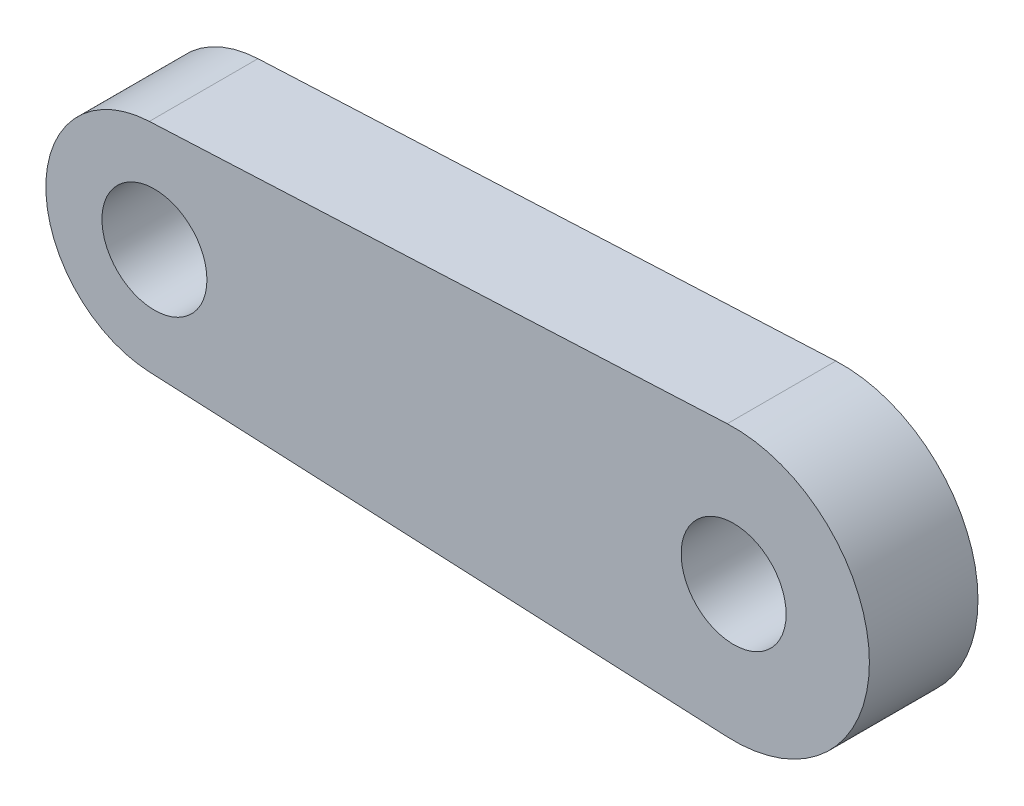
ISO-10303-21;
HEADER;
FILE_DESCRIPTION(('STEP AP214'),'2;1');
FILE_NAME('part.step','',(''),(''),'','','');
FILE_SCHEMA(('AUTOMOTIVE_DESIGN { 1 0 10303 214 1 1 1 1 }'));
ENDSEC;
DATA;
#1=APPLICATION_CONTEXT('core data for automotive mechanical design processes');
#2=APPLICATION_PROTOCOL_DEFINITION('international standard','automotive_design',2000,#1);
#3=PRODUCT_CONTEXT('',#1,'mechanical');
#4=PRODUCT('Part','Part','',(#3));
#5=PRODUCT_RELATED_PRODUCT_CATEGORY('part','',(#4));
#6=PRODUCT_DEFINITION_FORMATION('','',#4);
#7=PRODUCT_DEFINITION_CONTEXT('part definition',#1,'design');
#8=PRODUCT_DEFINITION('design','',#6,#7);
#9=PRODUCT_DEFINITION_SHAPE('','',#8);
#10=(LENGTH_UNIT() NAMED_UNIT(*) SI_UNIT(.MILLI.,.METRE.));
#11=(NAMED_UNIT(*) PLANE_ANGLE_UNIT() SI_UNIT($,.RADIAN.));
#12=(NAMED_UNIT(*) SI_UNIT($,.STERADIAN.) SOLID_ANGLE_UNIT());
#13=UNCERTAINTY_MEASURE_WITH_UNIT(LENGTH_MEASURE(1.E-05),#10,'distance_accuracy_value','');
#14=(GEOMETRIC_REPRESENTATION_CONTEXT(3) GLOBAL_UNCERTAINTY_ASSIGNED_CONTEXT((#13)) GLOBAL_UNIT_ASSIGNED_CONTEXT((#10,
#11,#12)) REPRESENTATION_CONTEXT('',''));
#15=CARTESIAN_POINT('',(0.,0.,0.));
#16=DIRECTION('',(0.,0.,1.));
#17=DIRECTION('',(1.,0.,0.));
#18=AXIS2_PLACEMENT_3D('',#15,#16,#17);
#19=CARTESIAN_POINT('',(7.6248333333333,1.11022302462516E-13,3.));
#20=DIRECTION('',(0.,0.,1.));
#21=DIRECTION('',(1.,0.,0.));
#22=AXIS2_PLACEMENT_3D('',#19,#20,#21);
#23=PLANE('',#22);
#24=CARTESIAN_POINT('',(7.6248333333333,1.11022302462516E-13,3.));
#25=DIRECTION('',(0.,0.,1.));
#26=DIRECTION('',(1.,0.,0.));
#27=AXIS2_PLACEMENT_3D('',#24,#25,#26);
#28=CIRCLE('',#27,1.44999999999995);
#29=CARTESIAN_POINT('',(9.07483333333325,1.11022302462516E-13,3.));
#30=VERTEX_POINT('',#29);
#31=EDGE_CURVE('E99',#30,#30,#28,.T.);
#32=ORIENTED_EDGE('',*,*,#31,.F.);
#33=EDGE_LOOP('',(#32));
#34=FACE_BOUND('',#33,.T.);
#35=CARTESIAN_POINT('',(7.6248333333333,1.11022302462516E-13,3.));
#36=DIRECTION('',(0.,0.,1.));
#37=DIRECTION('',(1.,0.,0.));
#38=AXIS2_PLACEMENT_3D('',#35,#36,#37);
#39=CIRCLE('',#38,3.75);
#40=CARTESIAN_POINT('',(7.44905208333332,-3.74587786134952,3.));
#41=VERTEX_POINT('',#40);
#42=CARTESIAN_POINT('',(7.44905208333332,3.74587786134952,3.));
#43=VERTEX_POINT('',#42);
#44=EDGE_CURVE('E84',#41,#43,#39,.T.);
#45=ORIENTED_EDGE('',*,*,#44,.T.);
#46=DIRECTION('',(-0.998900763026539,-0.046874999999993,0.));
#47=VECTOR('',#46,1.);
#48=CARTESIAN_POINT('',(7.44905208333332,3.74587786134952,3.));
#49=LINE('',#48,#47);
#50=CARTESIAN_POINT('',(-8.5157916666667,2.99670228907984,3.));
#51=VERTEX_POINT('',#50);
#52=EDGE_CURVE('E79',#43,#51,#49,.T.);
#53=ORIENTED_EDGE('',*,*,#52,.T.);
#54=CARTESIAN_POINT('',(-8.37516666666671,1.11022302462516E-13,3.));
#55=DIRECTION('',(0.,0.,1.));
#56=DIRECTION('',(1.,0.,0.));
#57=AXIS2_PLACEMENT_3D('',#54,#55,#56);
#58=CIRCLE('',#57,3.00000000000011);
#59=CARTESIAN_POINT('',(-8.5157916666667,-2.99670228907973,3.));
#60=VERTEX_POINT('',#59);
#61=EDGE_CURVE('E82',#51,#60,#58,.T.);
#62=ORIENTED_EDGE('',*,*,#61,.T.);
#63=DIRECTION('',(0.998900763026539,-0.046874999999993,0.));
#64=VECTOR('',#63,1.);
#65=CARTESIAN_POINT('',(-8.5157916666667,-2.99670228907973,3.));
#66=LINE('',#65,#64);
#67=EDGE_CURVE('E49',#60,#41,#66,.T.);
#68=ORIENTED_EDGE('',*,*,#67,.T.);
#69=EDGE_LOOP('',(#45,#53,#62,#68));
#70=FACE_BOUND('',#69,.T.);
#71=CARTESIAN_POINT('',(-8.37516666666671,1.11022302462516E-13,3.));
#72=DIRECTION('',(0.,0.,1.));
#73=DIRECTION('',(1.,0.,0.));
#74=AXIS2_PLACEMENT_3D('',#71,#72,#73);
#75=CIRCLE('',#74,1.44999999999995);
#76=CARTESIAN_POINT('',(-6.92516666666676,1.11022302462516E-13,3.));
#77=VERTEX_POINT('',#76);
#78=EDGE_CURVE('E114',#77,#77,#75,.T.);
#79=ORIENTED_EDGE('',*,*,#78,.F.);
#80=EDGE_LOOP('',(#79));
#81=FACE_BOUND('',#80,.T.);
#82=ADVANCED_FACE('F32',(#34,#70,#81),#23,.T.);
#83=CARTESIAN_POINT('',(7.6248333333333,1.11022302462516E-13,0.));
#84=DIRECTION('',(0.,0.,1.));
#85=DIRECTION('',(1.,0.,0.));
#86=AXIS2_PLACEMENT_3D('',#83,#84,#85);
#87=PLANE('',#86);
#88=CARTESIAN_POINT('',(7.6248333333333,1.11022302462516E-13,0.));
#89=DIRECTION('',(0.,0.,1.));
#90=DIRECTION('',(1.,0.,0.));
#91=AXIS2_PLACEMENT_3D('',#88,#89,#90);
#92=CIRCLE('',#91,3.75);
#93=CARTESIAN_POINT('',(7.44905208333332,-3.74587786134952,0.));
#94=VERTEX_POINT('',#93);
#95=CARTESIAN_POINT('',(7.44905208333332,3.74587786134952,0.));
#96=VERTEX_POINT('',#95);
#97=EDGE_CURVE('E96',#94,#96,#92,.T.);
#98=ORIENTED_EDGE('',*,*,#97,.F.);
#99=DIRECTION('',(0.998900763026539,-0.046874999999993,0.));
#100=VECTOR('',#99,1.);
#101=CARTESIAN_POINT('',(-8.5157916666667,-2.99670228907973,0.));
#102=LINE('',#101,#100);
#103=CARTESIAN_POINT('',(-8.5157916666667,-2.99670228907973,0.));
#104=VERTEX_POINT('',#103);
#105=EDGE_CURVE('E72',#104,#94,#102,.T.);
#106=ORIENTED_EDGE('',*,*,#105,.F.);
#107=CARTESIAN_POINT('',(-8.37516666666671,1.11022302462516E-13,0.));
#108=DIRECTION('',(0.,0.,1.));
#109=DIRECTION('',(1.,0.,0.));
#110=AXIS2_PLACEMENT_3D('',#107,#108,#109);
#111=CIRCLE('',#110,3.00000000000011);
#112=CARTESIAN_POINT('',(-8.5157916666667,2.99670228907984,0.));
#113=VERTEX_POINT('',#112);
#114=EDGE_CURVE('E66',#113,#104,#111,.T.);
#115=ORIENTED_EDGE('',*,*,#114,.F.);
#116=DIRECTION('',(-0.998900763026539,-0.046874999999993,0.));
#117=VECTOR('',#116,1.);
#118=CARTESIAN_POINT('',(7.44905208333332,3.74587786134952,0.));
#119=LINE('',#118,#117);
#120=EDGE_CURVE('E88',#96,#113,#119,.T.);
#121=ORIENTED_EDGE('',*,*,#120,.F.);
#122=EDGE_LOOP('',(#98,#106,#115,#121));
#123=FACE_BOUND('',#122,.T.);
#124=CARTESIAN_POINT('',(7.6248333333333,1.11022302462516E-13,0.));
#125=DIRECTION('',(0.,0.,1.));
#126=DIRECTION('',(1.,0.,0.));
#127=AXIS2_PLACEMENT_3D('',#124,#125,#126);
#128=CIRCLE('',#127,1.44999999999995);
#129=CARTESIAN_POINT('',(9.07483333333325,1.11022302462516E-13,0.));
#130=VERTEX_POINT('',#129);
#131=EDGE_CURVE('E111',#130,#130,#128,.T.);
#132=ORIENTED_EDGE('',*,*,#131,.T.);
#133=EDGE_LOOP('',(#132));
#134=FACE_BOUND('',#133,.T.);
#135=CARTESIAN_POINT('',(-8.37516666666671,1.11022302462516E-13,0.));
#136=DIRECTION('',(0.,0.,1.));
#137=DIRECTION('',(1.,0.,0.));
#138=AXIS2_PLACEMENT_3D('',#135,#136,#137);
#139=CIRCLE('',#138,1.44999999999995);
#140=CARTESIAN_POINT('',(-6.92516666666676,1.11022302462516E-13,0.));
#141=VERTEX_POINT('',#140);
#142=EDGE_CURVE('E117',#141,#141,#139,.T.);
#143=ORIENTED_EDGE('',*,*,#142,.T.);
#144=EDGE_LOOP('',(#143));
#145=FACE_BOUND('',#144,.T.);
#146=ADVANCED_FACE('F107',(#123,#134,#145),#87,.F.);
#147=CARTESIAN_POINT('',(7.6248333333333,1.11022302462516E-13,3.));
#148=DIRECTION('',(0.,0.,-1.));
#149=DIRECTION('',(-1.,0.,0.));
#150=AXIS2_PLACEMENT_3D('',#147,#148,#149);
#151=CYLINDRICAL_SURFACE('',#150,3.75);
#152=ORIENTED_EDGE('',*,*,#97,.T.);
#153=DIRECTION('',(0.,0.,-1.));
#154=VECTOR('',#153,1.);
#155=CARTESIAN_POINT('',(7.44905208333332,3.74587786134952,3.));
#156=LINE('',#155,#154);
#157=EDGE_CURVE('E11',#43,#96,#156,.T.);
#158=ORIENTED_EDGE('',*,*,#157,.F.);
#159=ORIENTED_EDGE('',*,*,#44,.F.);
#160=DIRECTION('',(0.,0.,-1.));
#161=VECTOR('',#160,1.);
#162=CARTESIAN_POINT('',(7.44905208333332,-3.74587786134952,3.));
#163=LINE('',#162,#161);
#164=EDGE_CURVE('E92',#41,#94,#163,.T.);
#165=ORIENTED_EDGE('',*,*,#164,.T.);
#166=EDGE_LOOP('',(#152,#158,#159,#165));
#167=FACE_BOUND('',#166,.T.);
#168=ADVANCED_FACE('F34',(#167),#151,.T.);
#169=CARTESIAN_POINT('',(7.44905208333332,3.74587786134952,3.));
#170=DIRECTION('',(0.046874999999993,-0.998900763026538,0.));
#171=DIRECTION('',(0.998900763026539,0.046874999999993,0.));
#172=AXIS2_PLACEMENT_3D('',#169,#170,#171);
#173=PLANE('',#172);
#174=ORIENTED_EDGE('',*,*,#120,.T.);
#175=DIRECTION('',(0.,0.,-1.));
#176=VECTOR('',#175,1.);
#177=CARTESIAN_POINT('',(-8.5157916666667,2.99670228907984,3.));
#178=LINE('',#177,#176);
#179=EDGE_CURVE('E41',#51,#113,#178,.T.);
#180=ORIENTED_EDGE('',*,*,#179,.F.);
#181=ORIENTED_EDGE('',*,*,#52,.F.);
#182=ORIENTED_EDGE('',*,*,#157,.T.);
#183=EDGE_LOOP('',(#174,#180,#181,#182));
#184=FACE_BOUND('',#183,.T.);
#185=ADVANCED_FACE('F87',(#184),#173,.F.);
#186=CARTESIAN_POINT('',(-8.37516666666671,1.11022302462516E-13,3.));
#187=DIRECTION('',(0.,0.,-1.));
#188=DIRECTION('',(-1.,0.,0.));
#189=AXIS2_PLACEMENT_3D('',#186,#187,#188);
#190=CYLINDRICAL_SURFACE('',#189,3.00000000000011);
#191=ORIENTED_EDGE('',*,*,#114,.T.);
#192=DIRECTION('',(0.,0.,-1.));
#193=VECTOR('',#192,1.);
#194=CARTESIAN_POINT('',(-8.5157916666667,-2.99670228907973,3.));
#195=LINE('',#194,#193);
#196=EDGE_CURVE('E89',#60,#104,#195,.T.);
#197=ORIENTED_EDGE('',*,*,#196,.F.);
#198=ORIENTED_EDGE('',*,*,#61,.F.);
#199=ORIENTED_EDGE('',*,*,#179,.T.);
#200=EDGE_LOOP('',(#191,#197,#198,#199));
#201=FACE_BOUND('',#200,.T.);
#202=ADVANCED_FACE('F90',(#201),#190,.T.);
#203=CARTESIAN_POINT('',(-8.5157916666667,-2.99670228907973,3.));
#204=DIRECTION('',(0.046874999999993,0.998900763026538,0.));
#205=DIRECTION('',(-0.998900763026539,0.046874999999993,0.));
#206=AXIS2_PLACEMENT_3D('',#203,#204,#205);
#207=PLANE('',#206);
#208=ORIENTED_EDGE('',*,*,#105,.T.);
#209=ORIENTED_EDGE('',*,*,#164,.F.);
#210=ORIENTED_EDGE('',*,*,#67,.F.);
#211=ORIENTED_EDGE('',*,*,#196,.T.);
#212=EDGE_LOOP('',(#208,#209,#210,#211));
#213=FACE_BOUND('',#212,.T.);
#214=ADVANCED_FACE('F104',(#213),#207,.F.);
#215=CARTESIAN_POINT('',(7.6248333333333,1.11022302462516E-13,3.));
#216=DIRECTION('',(0.,0.,-1.));
#217=DIRECTION('',(-1.,0.,0.));
#218=AXIS2_PLACEMENT_3D('',#215,#216,#217);
#219=CYLINDRICAL_SURFACE('',#218,1.44999999999995);
#220=ORIENTED_EDGE('',*,*,#31,.T.);
#221=EDGE_LOOP('',(#220));
#222=FACE_BOUND('',#221,.T.);
#223=ORIENTED_EDGE('',*,*,#131,.F.);
#224=EDGE_LOOP('',(#223));
#225=FACE_BOUND('',#224,.T.);
#226=ADVANCED_FACE('F134',(#222,#225),#219,.F.);
#227=CARTESIAN_POINT('',(-8.37516666666671,1.11022302462516E-13,3.));
#228=DIRECTION('',(0.,0.,-1.));
#229=DIRECTION('',(-1.,0.,0.));
#230=AXIS2_PLACEMENT_3D('',#227,#228,#229);
#231=CYLINDRICAL_SURFACE('',#230,1.44999999999995);
#232=ORIENTED_EDGE('',*,*,#78,.T.);
#233=EDGE_LOOP('',(#232));
#234=FACE_BOUND('',#233,.T.);
#235=ORIENTED_EDGE('',*,*,#142,.F.);
#236=EDGE_LOOP('',(#235));
#237=FACE_BOUND('',#236,.T.);
#238=ADVANCED_FACE('F123',(#234,#237),#231,.F.);
#239=CLOSED_SHELL('',(#82,#146,#168,#185,#202,#214,#226,#238));
#240=MANIFOLD_SOLID_BREP('B2',#239);
#241=ADVANCED_BREP_SHAPE_REPRESENTATION('',(#18,#240),#14);
#242=SHAPE_DEFINITION_REPRESENTATION(#9,#241);
ENDSEC;
END-ISO-10303-21;
